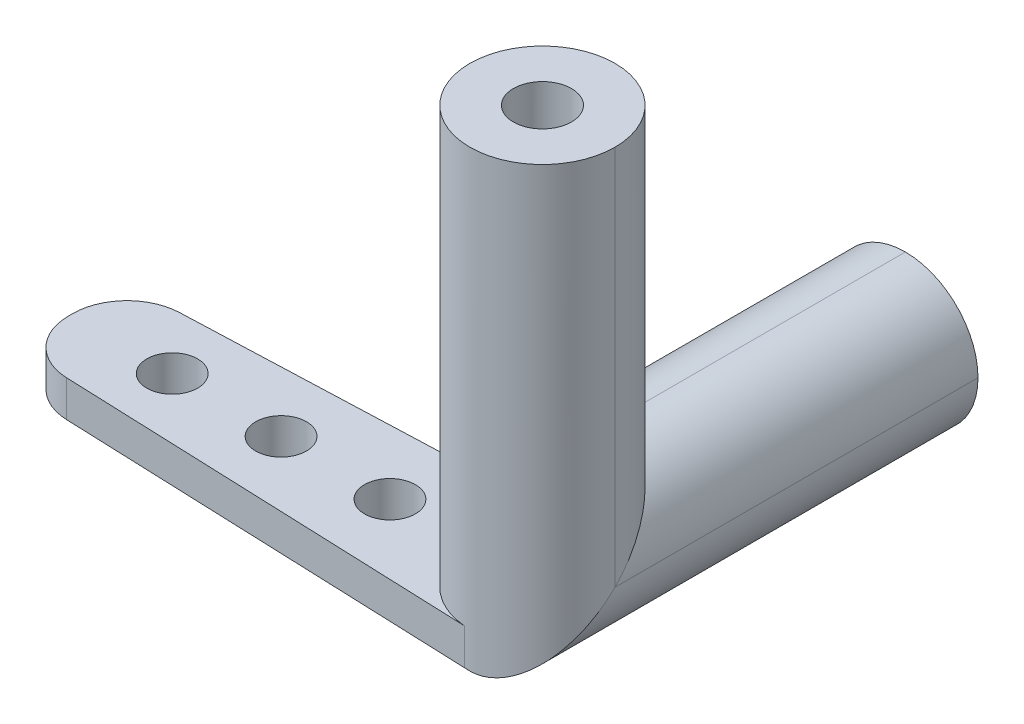
ISO-10303-21;
HEADER;
FILE_DESCRIPTION(('STEP AP214'),'2;1');
FILE_NAME('part.step','',(''),(''),'','','');
FILE_SCHEMA(('AUTOMOTIVE_DESIGN { 1 0 10303 214 1 1 1 1 }'));
ENDSEC;
DATA;
#1=APPLICATION_CONTEXT('core data for automotive mechanical design processes');
#2=APPLICATION_PROTOCOL_DEFINITION('international standard','automotive_design',2000,#1);
#3=PRODUCT_CONTEXT('',#1,'mechanical');
#4=PRODUCT('Part','Part','',(#3));
#5=PRODUCT_RELATED_PRODUCT_CATEGORY('part','',(#4));
#6=PRODUCT_DEFINITION_FORMATION('','',#4);
#7=PRODUCT_DEFINITION_CONTEXT('part definition',#1,'design');
#8=PRODUCT_DEFINITION('design','',#6,#7);
#9=PRODUCT_DEFINITION_SHAPE('','',#8);
#10=(LENGTH_UNIT() NAMED_UNIT(*) SI_UNIT(.MILLI.,.METRE.));
#11=(NAMED_UNIT(*) PLANE_ANGLE_UNIT() SI_UNIT($,.RADIAN.));
#12=(NAMED_UNIT(*) SI_UNIT($,.STERADIAN.) SOLID_ANGLE_UNIT());
#13=UNCERTAINTY_MEASURE_WITH_UNIT(LENGTH_MEASURE(1.E-05),#10,'distance_accuracy_value','');
#14=(GEOMETRIC_REPRESENTATION_CONTEXT(3) GLOBAL_UNCERTAINTY_ASSIGNED_CONTEXT((#13)) GLOBAL_UNIT_ASSIGNED_CONTEXT((#10,
#11,#12)) REPRESENTATION_CONTEXT('',''));
#15=CARTESIAN_POINT('',(0.,0.,0.));
#16=DIRECTION('',(0.,0.,1.));
#17=DIRECTION('',(1.,0.,0.));
#18=AXIS2_PLACEMENT_3D('',#15,#16,#17);
#19=CARTESIAN_POINT('',(2.,2.00000000000001,0.));
#20=DIRECTION('',(0.,0.,-1.));
#21=DIRECTION('',(0.,1.,0.));
#22=AXIS2_PLACEMENT_3D('',#19,#20,#21);
#23=CYLINDRICAL_SURFACE('',#22,2.);
#24=DIRECTION('',(0.,0.,1.));
#25=VECTOR('',#24,1.);
#26=CARTESIAN_POINT('',(2.,0.,-12.));
#27=LINE('',#26,#25);
#28=CARTESIAN_POINT('',(2.,0.,-4.));
#29=VERTEX_POINT('',#28);
#30=CARTESIAN_POINT('',(2.,0.,-12.));
#31=VERTEX_POINT('',#30);
#32=EDGE_CURVE('E385',#29,#31,#27,.F.);
#33=ORIENTED_EDGE('',*,*,#32,.F.);
#34=CARTESIAN_POINT('',(2.,2.,-4.));
#35=DIRECTION('',(0.0384331221012044,0.,0.999261174631314));
#36=DIRECTION('',(0.999261174631314,0.,-0.0384331221012044));
#37=AXIS2_PLACEMENT_3D('',#34,#35,#36);
#38=ELLIPSE('',#37,2.00147874327041,2.);
#39=CARTESIAN_POINT('',(0.26794919243113,0.999999999999994,-3.93338266124735));
#40=VERTEX_POINT('',#39);
#41=EDGE_CURVE('E161',#29,#40,#38,.F.);
#42=ORIENTED_EDGE('',*,*,#41,.T.);
#43=DIRECTION('',(0.,0.,-1.));
#44=VECTOR('',#43,1.);
#45=CARTESIAN_POINT('',(0.26794919243113,1.,0.));
#46=LINE('',#45,#44);
#47=CARTESIAN_POINT('',(0.267949192431128,1.,-0.99999999999999));
#48=VERTEX_POINT('',#47);
#49=EDGE_CURVE('E159',#48,#40,#46,.T.);
#50=ORIENTED_EDGE('',*,*,#49,.F.);
#51=CARTESIAN_POINT('',(2.,2.00000000000001,-2.));
#52=DIRECTION('',(0.,-0.707106781186549,-0.707106781186546));
#53=DIRECTION('',(0.,-0.707106781186546,0.707106781186549));
#54=AXIS2_PLACEMENT_3D('',#51,#52,#53);
#55=ELLIPSE('',#54,2.82842712474619,2.);
#56=CARTESIAN_POINT('',(0.,2.00000000000001,-2.));
#57=VERTEX_POINT('',#56);
#58=EDGE_CURVE('E145',#57,#48,#55,.F.);
#59=ORIENTED_EDGE('',*,*,#58,.F.);
#60=DIRECTION('',(0.,0.,-1.));
#61=VECTOR('',#60,1.);
#62=CARTESIAN_POINT('',(0.,1.99999999999997,-12.));
#63=LINE('',#62,#61);
#64=CARTESIAN_POINT('',(0.,1.99999999999997,-12.));
#65=VERTEX_POINT('',#64);
#66=EDGE_CURVE('E363',#57,#65,#63,.T.);
#67=ORIENTED_EDGE('',*,*,#66,.T.);
#68=CARTESIAN_POINT('',(2.,1.99999999999997,-12.));
#69=DIRECTION('',(0.,0.,-1.));
#70=DIRECTION('',(0.,1.,0.));
#71=AXIS2_PLACEMENT_3D('',#68,#69,#70);
#72=CIRCLE('',#71,2.);
#73=EDGE_CURVE('E372',#31,#65,#72,.T.);
#74=ORIENTED_EDGE('',*,*,#73,.F.);
#75=EDGE_LOOP('',(#33,#42,#50,#59,#67,#74));
#76=FACE_BOUND('',#75,.T.);
#77=ADVANCED_FACE('F43',(#76),#23,.T.);
#78=CARTESIAN_POINT('',(4.,0.,-12.));
#79=DIRECTION('',(0.,0.,-1.));
#80=DIRECTION('',(0.,1.,0.));
#81=AXIS2_PLACEMENT_3D('',#78,#79,#80);
#82=PLANE('',#81);
#83=CARTESIAN_POINT('',(2.,1.99999999999997,-12.));
#84=DIRECTION('',(0.,0.,-1.));
#85=DIRECTION('',(0.,1.,0.));
#86=AXIS2_PLACEMENT_3D('',#83,#84,#85);
#87=CIRCLE('',#86,0.8);
#88=CARTESIAN_POINT('',(2.,2.79999999999997,-12.));
#89=VERTEX_POINT('',#88);
#90=EDGE_CURVE('E188',#89,#89,#87,.T.);
#91=ORIENTED_EDGE('',*,*,#90,.F.);
#92=EDGE_LOOP('',(#91));
#93=FACE_BOUND('',#92,.T.);
#94=CARTESIAN_POINT('',(2.,1.99999999999997,-12.));
#95=DIRECTION('',(0.,0.,-1.));
#96=DIRECTION('',(0.,1.,0.));
#97=AXIS2_PLACEMENT_3D('',#94,#95,#96);
#98=CIRCLE('',#97,2.);
#99=CARTESIAN_POINT('',(2.,3.99999999999997,-12.));
#100=VERTEX_POINT('',#99);
#101=CARTESIAN_POINT('',(4.,1.99999999999997,-12.));
#102=VERTEX_POINT('',#101);
#103=EDGE_CURVE('E366',#100,#102,#98,.T.);
#104=ORIENTED_EDGE('',*,*,#103,.T.);
#105=CARTESIAN_POINT('',(2.,1.99999999999997,-12.));
#106=DIRECTION('',(0.,0.,-1.));
#107=DIRECTION('',(0.,1.,0.));
#108=AXIS2_PLACEMENT_3D('',#105,#106,#107);
#109=CIRCLE('',#108,2.);
#110=EDGE_CURVE('E252',#102,#31,#109,.T.);
#111=ORIENTED_EDGE('',*,*,#110,.T.);
#112=ORIENTED_EDGE('',*,*,#73,.T.);
#113=CARTESIAN_POINT('',(2.,1.99999999999997,-12.));
#114=DIRECTION('',(0.,0.,-1.));
#115=DIRECTION('',(0.,1.,0.));
#116=AXIS2_PLACEMENT_3D('',#113,#114,#115);
#117=CIRCLE('',#116,2.);
#118=EDGE_CURVE('E212',#65,#100,#117,.T.);
#119=ORIENTED_EDGE('',*,*,#118,.T.);
#120=EDGE_LOOP('',(#104,#111,#112,#119));
#121=FACE_BOUND('',#120,.T.);
#122=ADVANCED_FACE('F230',(#93,#121),#82,.T.);
#123=CARTESIAN_POINT('',(4.,12.5,0.));
#124=DIRECTION('',(0.,1.,0.));
#125=DIRECTION('',(0.,0.,1.));
#126=AXIS2_PLACEMENT_3D('',#123,#124,#125);
#127=PLANE('',#126);
#128=CARTESIAN_POINT('',(2.,12.5,-2.));
#129=DIRECTION('',(0.,1.,0.));
#130=DIRECTION('',(0.,0.,1.));
#131=AXIS2_PLACEMENT_3D('',#128,#129,#130);
#132=CIRCLE('',#131,0.8);
#133=CARTESIAN_POINT('',(2.,12.5,-1.2));
#134=VERTEX_POINT('',#133);
#135=EDGE_CURVE('E187',#134,#134,#132,.T.);
#136=ORIENTED_EDGE('',*,*,#135,.F.);
#137=EDGE_LOOP('',(#136));
#138=FACE_BOUND('',#137,.T.);
#139=CARTESIAN_POINT('',(2.,12.5,-2.));
#140=DIRECTION('',(0.,1.,0.));
#141=DIRECTION('',(0.,0.,1.));
#142=AXIS2_PLACEMENT_3D('',#139,#140,#141);
#143=CIRCLE('',#142,2.);
#144=CARTESIAN_POINT('',(0.,12.5,-2.));
#145=VERTEX_POINT('',#144);
#146=CARTESIAN_POINT('',(2.,12.5,0.));
#147=VERTEX_POINT('',#146);
#148=EDGE_CURVE('E194',#145,#147,#143,.T.);
#149=ORIENTED_EDGE('',*,*,#148,.T.);
#150=CARTESIAN_POINT('',(2.,12.5,-2.));
#151=DIRECTION('',(0.,1.,0.));
#152=DIRECTION('',(0.,0.,1.));
#153=AXIS2_PLACEMENT_3D('',#150,#151,#152);
#154=CIRCLE('',#153,2.);
#155=CARTESIAN_POINT('',(4.,12.5,-2.));
#156=VERTEX_POINT('',#155);
#157=EDGE_CURVE('E200',#147,#156,#154,.T.);
#158=ORIENTED_EDGE('',*,*,#157,.T.);
#159=CARTESIAN_POINT('',(2.,12.5,-2.));
#160=DIRECTION('',(0.,1.,0.));
#161=DIRECTION('',(0.,0.,1.));
#162=AXIS2_PLACEMENT_3D('',#159,#160,#161);
#163=CIRCLE('',#162,2.);
#164=CARTESIAN_POINT('',(2.,12.5,-4.));
#165=VERTEX_POINT('',#164);
#166=EDGE_CURVE('E198',#156,#165,#163,.T.);
#167=ORIENTED_EDGE('',*,*,#166,.T.);
#168=CARTESIAN_POINT('',(2.,12.5,-2.));
#169=DIRECTION('',(0.,1.,0.));
#170=DIRECTION('',(0.,0.,1.));
#171=AXIS2_PLACEMENT_3D('',#168,#169,#170);
#172=CIRCLE('',#171,2.);
#173=EDGE_CURVE('E196',#165,#145,#172,.T.);
#174=ORIENTED_EDGE('',*,*,#173,.T.);
#175=EDGE_LOOP('',(#149,#158,#167,#174));
#176=FACE_BOUND('',#175,.T.);
#177=ADVANCED_FACE('F226',(#138,#176),#127,.T.);
#178=CARTESIAN_POINT('',(2.,1.73725830020306,-2.));
#179=DIRECTION('',(0.,1.,0.));
#180=DIRECTION('',(0.,0.,1.));
#181=AXIS2_PLACEMENT_3D('',#178,#179,#180);
#182=CYLINDRICAL_SURFACE('',#181,0.8);
#183=ORIENTED_EDGE('',*,*,#135,.T.);
#184=EDGE_LOOP('',(#183));
#185=FACE_BOUND('',#184,.T.);
#186=CARTESIAN_POINT('',(2.,0.,-2.8));
#187=CARTESIAN_POINT('',(2.02159831677043,-1.8616177813928E-06,-2.8000007467171));
#188=CARTESIAN_POINT('',(2.04318552441436,0.000350269845648965,-2.79912475724533));
#189=CARTESIAN_POINT('',(2.0861904940867,0.00174254682550426,-2.79563599151247));
#190=CARTESIAN_POINT('',(2.10760830440727,0.00278248853754494,-2.7930237297234));
#191=CARTESIAN_POINT('',(2.1712230162056,0.00689257694576575,-2.78263666924842));
#192=CARTESIAN_POINT('',(2.21296956929793,0.0109533376282357,-2.77231125536127));
#193=CARTESIAN_POINT('',(2.29396966864772,0.0213001227870144,-2.74525673480718));
#194=CARTESIAN_POINT('',(2.33322487967818,0.0275846424316137,-2.72853195800847));
#195=CARTESIAN_POINT('',(2.40838776059142,0.0417651950573027,-2.68921650115708));
#196=CARTESIAN_POINT('',(2.44429300078165,0.0496623846525593,-2.66662160784633));
#197=CARTESIAN_POINT('',(2.51340313840996,0.0666769196882175,-2.61510432146704));
#198=CARTESIAN_POINT('',(2.54642877879827,0.075831822927183,-2.58595409872517));
#199=CARTESIAN_POINT('',(2.60727287497054,0.0941587126501767,-2.52263621997696));
#200=CARTESIAN_POINT('',(2.6350893618162,0.103330704275621,-2.48846667545693));
#201=CARTESIAN_POINT('',(2.68595014063606,0.121108920482231,-2.41422839801925));
#202=CARTESIAN_POINT('',(2.70872645876909,0.129671704971954,-2.37396460765669));
#203=CARTESIAN_POINT('',(2.74710218223958,0.144665539592396,-2.2897845697114));
#204=CARTESIAN_POINT('',(2.76270513755407,0.1510976437197,-2.2458701415017));
#205=CARTESIAN_POINT('',(2.78555941721611,0.160694520611915,-2.15771551436484));
#206=CARTESIAN_POINT('',(2.79315743012602,0.163994250627382,-2.11358042410118));
#207=CARTESIAN_POINT('',(2.80086918031491,0.167343981989817,-2.02454693461503));
#208=CARTESIAN_POINT('',(2.80098644314194,0.167395514156073,-1.97964890493238));
#209=CARTESIAN_POINT('',(2.79399571921285,0.164357986492038,-1.89369697804716));
#210=CARTESIAN_POINT('',(2.78739001505455,0.161487250614816,-1.85259301354298));
#211=CARTESIAN_POINT('',(2.76797853172649,0.153295159109221,-1.77213550619189));
#212=CARTESIAN_POINT('',(2.75517177604126,0.147973417513243,-1.7327822401037));
#213=CARTESIAN_POINT('',(2.72347797855633,0.135362090359313,-1.65599305326941));
#214=CARTESIAN_POINT('',(2.70447215978279,0.128034553809571,-1.61861266723954));
#215=CARTESIAN_POINT('',(2.66100278767393,0.112247615385342,-1.54743399539527));
#216=CARTESIAN_POINT('',(2.63653713229394,0.103787778076929,-1.51363709664094));
#217=CARTESIAN_POINT('',(2.58062203969077,0.0858935895915894,-1.44783808829517));
#218=CARTESIAN_POINT('',(2.54877915271876,0.0764344369430068,-1.41617620820553));
#219=CARTESIAN_POINT('',(2.48012954504219,0.0581617170839123,-1.35852917757767));
#220=CARTESIAN_POINT('',(2.44332126754626,0.0493483536894931,-1.33254581413741));
#221=CARTESIAN_POINT('',(2.36481236770107,0.0331370475106564,-1.28654113459255));
#222=CARTESIAN_POINT('',(2.32302785025109,0.0257713387373304,-1.2666510373912));
#223=CARTESIAN_POINT('',(2.23635571338169,0.0135355319165765,-1.23431925966314));
#224=CARTESIAN_POINT('',(2.19147298414069,0.00866159868195644,-1.22186612762088));
#225=CARTESIAN_POINT('',(2.1217837898764,0.0035651618756597,-1.20894554436054));
#226=CARTESIAN_POINT('',(2.09755880874177,0.00223291958890195,-1.20559469629288));
#227=CARTESIAN_POINT('',(2.04889406824094,0.000449035603604759,-1.20112204101431));
#228=CARTESIAN_POINT('',(2.02445452114523,-3.3953392237457E-06,-1.19999823599307));
#229=CARTESIAN_POINT('',(2.,0.,-1.2));
#230=B_SPLINE_CURVE_WITH_KNOTS('',3,(#186,#187,#188,#189,#190,#191,#192,#193,#194,#195,#196,
#197,#198,#199,#200,#201,#202,#203,#204,#205,#206,#207,#208,#209,#210,#211,#212,#213,#214,#215,
#216,#217,#218,#219,#220,#221,#222,#223,#224,#225,#226,#227,#228,#229),.UNSPECIFIED.,.F.,.F.,(4,
2,2,2,2,2,2,2,2,2,2,2,2,2,2,2,2,2,2,2,2,4),(0.,0.0647526799260257,0.129486181639265,
0.258395674984036,0.387218100767083,0.516133245130554,0.65051918153479,0.784955810610358,
0.925384652578942,1.06574392366056,1.19973726465172,1.33366745643372,1.45827660352849,
1.58290537993168,1.71007812612753,1.8372999187355,1.97434772588188,2.11143860172117,
2.25130229661043,2.39095006889911,2.46432062809039,2.53762533901017),.UNSPECIFIED.);
#231=CARTESIAN_POINT('',(2.,0.,-2.8));
#232=VERTEX_POINT('',#231);
#233=CARTESIAN_POINT('',(2.,0.,-1.2));
#234=VERTEX_POINT('',#233);
#235=EDGE_CURVE('E203',#232,#234,#230,.T.);
#236=ORIENTED_EDGE('',*,*,#235,.T.);
#237=CARTESIAN_POINT('',(2.,0.,-2.));
#238=DIRECTION('',(0.,1.,0.));
#239=DIRECTION('',(0.,0.,1.));
#240=AXIS2_PLACEMENT_3D('',#237,#238,#239);
#241=CIRCLE('',#240,0.8);
#242=EDGE_CURVE('E282',#232,#234,#241,.T.);
#243=ORIENTED_EDGE('',*,*,#242,.F.);
#244=EDGE_LOOP('',(#236,#243));
#245=FACE_BOUND('',#244,.T.);
#246=ADVANCED_FACE('F223',(#185,#245),#182,.F.);
#247=CARTESIAN_POINT('',(2.,2.,-4.00000000000001));
#248=DIRECTION('',(0.,0.,-1.));
#249=DIRECTION('',(0.,1.,0.));
#250=AXIS2_PLACEMENT_3D('',#247,#248,#249);
#251=CYLINDRICAL_SURFACE('',#250,0.8);
#252=CARTESIAN_POINT('',(2.,2.,-4.00000000000001));
#253=DIRECTION('',(0.,0.,-1.));
#254=DIRECTION('',(0.,1.,0.));
#255=AXIS2_PLACEMENT_3D('',#252,#253,#254);
#256=CIRCLE('',#255,0.8);
#257=CARTESIAN_POINT('',(2.,2.8,-4.00000000000001));
#258=VERTEX_POINT('',#257);
#259=EDGE_CURVE('E184',#258,#258,#256,.T.);
#260=ORIENTED_EDGE('',*,*,#259,.F.);
#261=EDGE_LOOP('',(#260));
#262=FACE_BOUND('',#261,.T.);
#263=ORIENTED_EDGE('',*,*,#90,.T.);
#264=EDGE_LOOP('',(#263));
#265=FACE_BOUND('',#264,.T.);
#266=ADVANCED_FACE('F221',(#262,#265),#251,.F.);
#267=CARTESIAN_POINT('',(2.,2.,-4.00000000000001));
#268=DIRECTION('',(0.,0.,-1.));
#269=DIRECTION('',(0.,1.,0.));
#270=AXIS2_PLACEMENT_3D('',#267,#268,#269);
#271=PLANE('',#270);
#272=ORIENTED_EDGE('',*,*,#259,.T.);
#273=EDGE_LOOP('',(#272));
#274=FACE_BOUND('',#273,.T.);
#275=ADVANCED_FACE('F349',(#274),#271,.T.);
#276=CARTESIAN_POINT('',(2.,2.00000000000002,0.));
#277=DIRECTION('',(0.,0.,1.));
#278=DIRECTION('',(0.,-1.,0.));
#279=AXIS2_PLACEMENT_3D('',#276,#277,#278);
#280=CYLINDRICAL_SURFACE('',#279,2.);
#281=DIRECTION('',(0.,0.,-1.));
#282=VECTOR('',#281,1.);
#283=CARTESIAN_POINT('',(2.,4.,-4.));
#284=LINE('',#283,#282);
#285=CARTESIAN_POINT('',(2.,4.,-4.));
#286=VERTEX_POINT('',#285);
#287=EDGE_CURVE('E191',#100,#286,#284,.F.);
#288=ORIENTED_EDGE('',*,*,#287,.F.);
#289=ORIENTED_EDGE('',*,*,#118,.F.);
#290=ORIENTED_EDGE('',*,*,#66,.F.);
#291=CARTESIAN_POINT('',(2.,2.00000000000001,-2.));
#292=DIRECTION('',(0.,0.707106781186549,0.707106781186546));
#293=DIRECTION('',(0.,0.707106781186546,-0.707106781186549));
#294=AXIS2_PLACEMENT_3D('',#291,#292,#293);
#295=ELLIPSE('',#294,2.82842712474619,2.);
#296=EDGE_CURVE('E361',#286,#57,#295,.T.);
#297=ORIENTED_EDGE('',*,*,#296,.F.);
#298=EDGE_LOOP('',(#288,#289,#290,#297));
#299=FACE_BOUND('',#298,.T.);
#300=ADVANCED_FACE('F346',(#299),#280,.T.);
#301=CARTESIAN_POINT('',(2.,2.00000000000002,0.));
#302=DIRECTION('',(0.,0.,-1.));
#303=DIRECTION('',(0.,1.,0.));
#304=AXIS2_PLACEMENT_3D('',#301,#302,#303);
#305=CYLINDRICAL_SURFACE('',#304,2.);
#306=ORIENTED_EDGE('',*,*,#103,.F.);
#307=ORIENTED_EDGE('',*,*,#287,.T.);
#308=CARTESIAN_POINT('',(2.,2.00000000000001,-2.));
#309=DIRECTION('',(0.,-0.707106781186549,-0.707106781186546));
#310=DIRECTION('',(0.,-0.707106781186546,0.707106781186549));
#311=AXIS2_PLACEMENT_3D('',#308,#309,#310);
#312=ELLIPSE('',#311,2.82842712474619,2.);
#313=CARTESIAN_POINT('',(4.,2.00000000000001,-2.));
#314=VERTEX_POINT('',#313);
#315=EDGE_CURVE('E387',#314,#286,#312,.F.);
#316=ORIENTED_EDGE('',*,*,#315,.F.);
#317=DIRECTION('',(0.,0.,-1.));
#318=VECTOR('',#317,1.);
#319=CARTESIAN_POINT('',(4.,2.00000000000002,0.));
#320=LINE('',#319,#318);
#321=EDGE_CURVE('E368',#102,#314,#320,.F.);
#322=ORIENTED_EDGE('',*,*,#321,.F.);
#323=EDGE_LOOP('',(#306,#307,#316,#322));
#324=FACE_BOUND('',#323,.T.);
#325=ADVANCED_FACE('F343',(#324),#305,.T.);
#326=CARTESIAN_POINT('',(2.,0.,-2.));
#327=DIRECTION('',(0.,1.,0.));
#328=DIRECTION('',(0.,0.,1.));
#329=AXIS2_PLACEMENT_3D('',#326,#327,#328);
#330=CYLINDRICAL_SURFACE('',#329,2.);
#331=DIRECTION('',(0.,1.,0.));
#332=VECTOR('',#331,1.);
#333=CARTESIAN_POINT('',(0.,0.,-2.));
#334=LINE('',#333,#332);
#335=EDGE_CURVE('E153',#145,#57,#334,.F.);
#336=ORIENTED_EDGE('',*,*,#335,.F.);
#337=ORIENTED_EDGE('',*,*,#173,.F.);
#338=DIRECTION('',(0.,1.,0.));
#339=VECTOR('',#338,1.);
#340=CARTESIAN_POINT('',(2.,0.,-4.));
#341=LINE('',#340,#339);
#342=EDGE_CURVE('E390',#286,#165,#341,.T.);
#343=ORIENTED_EDGE('',*,*,#342,.F.);
#344=ORIENTED_EDGE('',*,*,#296,.T.);
#345=EDGE_LOOP('',(#336,#337,#343,#344));
#346=FACE_BOUND('',#345,.T.);
#347=ADVANCED_FACE('F342',(#346),#330,.T.);
#348=CARTESIAN_POINT('',(2.,0.,-2.));
#349=DIRECTION('',(0.,-1.,0.));
#350=DIRECTION('',(0.,0.,-1.));
#351=AXIS2_PLACEMENT_3D('',#348,#349,#350);
#352=CYLINDRICAL_SURFACE('',#351,2.);
#353=ORIENTED_EDGE('',*,*,#342,.T.);
#354=ORIENTED_EDGE('',*,*,#166,.F.);
#355=DIRECTION('',(0.,1.,0.));
#356=VECTOR('',#355,1.);
#357=CARTESIAN_POINT('',(4.,12.5,-2.));
#358=LINE('',#357,#356);
#359=EDGE_CURVE('E379',#314,#156,#358,.T.);
#360=ORIENTED_EDGE('',*,*,#359,.F.);
#361=ORIENTED_EDGE('',*,*,#315,.T.);
#362=EDGE_LOOP('',(#353,#354,#360,#361));
#363=FACE_BOUND('',#362,.T.);
#364=ADVANCED_FACE('F522',(#363),#352,.T.);
#365=CARTESIAN_POINT('',(2.,2.00000000000001,0.));
#366=DIRECTION('',(0.,0.,1.));
#367=DIRECTION('',(0.,-1.,0.));
#368=AXIS2_PLACEMENT_3D('',#365,#366,#367);
#369=CYLINDRICAL_SURFACE('',#368,2.);
#370=ORIENTED_EDGE('',*,*,#110,.F.);
#371=ORIENTED_EDGE('',*,*,#321,.T.);
#372=CARTESIAN_POINT('',(2.,2.00000000000001,-2.));
#373=DIRECTION('',(0.,0.707106781186549,0.707106781186546));
#374=DIRECTION('',(0.,-0.707106781186546,0.707106781186549));
#375=AXIS2_PLACEMENT_3D('',#372,#373,#374);
#376=ELLIPSE('',#375,2.82842712474619,2.);
#377=CARTESIAN_POINT('',(2.,0.,0.));
#378=VERTEX_POINT('',#377);
#379=EDGE_CURVE('E378',#378,#314,#376,.T.);
#380=ORIENTED_EDGE('',*,*,#379,.F.);
#381=DIRECTION('',(0.,0.,1.));
#382=VECTOR('',#381,1.);
#383=CARTESIAN_POINT('',(2.,0.,-12.));
#384=LINE('',#383,#382);
#385=EDGE_CURVE('E156',#378,#234,#384,.F.);
#386=ORIENTED_EDGE('',*,*,#385,.T.);
#387=ORIENTED_EDGE('',*,*,#235,.F.);
#388=EDGE_CURVE('E382',#232,#29,#27,.F.);
#389=ORIENTED_EDGE('',*,*,#388,.T.);
#390=ORIENTED_EDGE('',*,*,#32,.T.);
#391=EDGE_LOOP('',(#370,#371,#380,#386,#387,#389,#390));
#392=FACE_BOUND('',#391,.T.);
#393=ADVANCED_FACE('F214',(#392),#369,.T.);
#394=CARTESIAN_POINT('',(2.,0.,-2.));
#395=DIRECTION('',(0.,-1.,0.));
#396=DIRECTION('',(0.,0.,-1.));
#397=AXIS2_PLACEMENT_3D('',#394,#395,#396);
#398=CYLINDRICAL_SURFACE('',#397,2.);
#399=DIRECTION('',(0.,-1.,0.));
#400=VECTOR('',#399,1.);
#401=CARTESIAN_POINT('',(1.8463810930576,0.,-0.00590841949778489));
#402=LINE('',#401,#400);
#403=CARTESIAN_POINT('',(1.8463810930576,0.00590841949779783,-0.00590841949778481));
#404=VERTEX_POINT('',#403);
#405=CARTESIAN_POINT('',(1.8463810930576,1.,-0.00590841949778445));
#406=VERTEX_POINT('',#405);
#407=EDGE_CURVE('E162',#404,#406,#402,.F.);
#408=ORIENTED_EDGE('',*,*,#407,.F.);
#409=CARTESIAN_POINT('',(2.,0.,0.));
#410=CARTESIAN_POINT('',(1.92307692307693,0.,-0.00295857988165671));
#411=CARTESIAN_POINT('',(1.8463810930576,0.00590841949779826,-0.00590841949778444));
#412=B_SPLINE_CURVE_WITH_KNOTS('',2,(#409,#410,#411),.UNSPECIFIED.,.F.,.F.,(3,3),(0.,1.),.UNSPECIFIED.);
#413=EDGE_CURVE('E181',#378,#404,#412,.T.);
#414=ORIENTED_EDGE('',*,*,#413,.F.);
#415=ORIENTED_EDGE('',*,*,#379,.T.);
#416=ORIENTED_EDGE('',*,*,#359,.T.);
#417=ORIENTED_EDGE('',*,*,#157,.F.);
#418=DIRECTION('',(0.,1.,0.));
#419=VECTOR('',#418,1.);
#420=CARTESIAN_POINT('',(2.,0.,0.));
#421=LINE('',#420,#419);
#422=CARTESIAN_POINT('',(2.,1.,0.));
#423=VERTEX_POINT('',#422);
#424=EDGE_CURVE('E376',#147,#423,#421,.F.);
#425=ORIENTED_EDGE('',*,*,#424,.T.);
#426=ORIENTED_EDGE('',*,*,#424,.F.);
#427=ORIENTED_EDGE('',*,*,#148,.F.);
#428=ORIENTED_EDGE('',*,*,#335,.T.);
#429=ORIENTED_EDGE('',*,*,#58,.T.);
#430=CARTESIAN_POINT('',(2.,1.,-2.));
#431=DIRECTION('',(0.,1.,0.));
#432=DIRECTION('',(0.,0.,1.));
#433=AXIS2_PLACEMENT_3D('',#430,#431,#432);
#434=CIRCLE('',#433,2.);
#435=EDGE_CURVE('E149',#406,#48,#434,.F.);
#436=ORIENTED_EDGE('',*,*,#435,.F.);
#437=EDGE_LOOP('',(#408,#414,#415,#416,#417,#425,#426,#427,#428,#429,#436));
#438=FACE_BOUND('',#437,.T.);
#439=ADVANCED_FACE('F147',(#438),#398,.T.);
#440=CARTESIAN_POINT('',(-0.150664697193501,1.,-3.91728212703102));
#441=DIRECTION('',(0.0384331221012044,0.,0.999261174631314));
#442=DIRECTION('',(0.999261174631314,0.,-0.0384331221012044));
#443=AXIS2_PLACEMENT_3D('',#440,#441,#442);
#444=PLANE('',#443);
#445=DIRECTION('',(-0.999261174631314,0.,0.0384331221012044));
#446=VECTOR('',#445,1.);
#447=CARTESIAN_POINT('',(-0.150664697193501,0.,-3.91728212703102));
#448=LINE('',#447,#446);
#449=CARTESIAN_POINT('',(-9.5576496831518,0.,-3.55547501218647));
#450=VERTEX_POINT('',#449);
#451=EDGE_CURVE('E280',#29,#450,#448,.T.);
#452=ORIENTED_EDGE('',*,*,#451,.T.);
#453=DIRECTION('',(0.,-1.,0.));
#454=VECTOR('',#453,1.);
#455=CARTESIAN_POINT('',(-9.5576496831518,1.,-3.55547501218647));
#456=LINE('',#455,#454);
#457=CARTESIAN_POINT('',(-9.5576496831518,1.,-3.55547501218647));
#458=VERTEX_POINT('',#457);
#459=EDGE_CURVE('E11',#450,#458,#456,.F.);
#460=ORIENTED_EDGE('',*,*,#459,.T.);
#461=DIRECTION('',(-0.999261174631314,0.,0.0384331221012044));
#462=VECTOR('',#461,1.);
#463=CARTESIAN_POINT('',(-0.150664697193501,1.,-3.91728212703102));
#464=LINE('',#463,#462);
#465=EDGE_CURVE('E281',#40,#458,#464,.T.);
#466=ORIENTED_EDGE('',*,*,#465,.F.);
#467=ORIENTED_EDGE('',*,*,#41,.F.);
#468=EDGE_LOOP('',(#452,#460,#466,#467));
#469=FACE_BOUND('',#468,.T.);
#470=ADVANCED_FACE('F236',(#469),#444,.F.);
#471=CARTESIAN_POINT('',(-11.,1.,0.));
#472=DIRECTION('',(-1.,0.,0.));
#473=DIRECTION('',(0.,0.,1.));
#474=AXIS2_PLACEMENT_3D('',#471,#472,#473);
#475=PLANE('',#474);
#476=DIRECTION('',(0.,0.,-1.));
#477=VECTOR('',#476,1.);
#478=CARTESIAN_POINT('',(-11.,0.,0.));
#479=LINE('',#478,#477);
#480=CARTESIAN_POINT('',(-11.,0.,-1.9434167497605));
#481=VERTEX_POINT('',#480);
#482=CARTESIAN_POINT('',(-11.,0.,-2.0565832502395));
#483=VERTEX_POINT('',#482);
#484=EDGE_CURVE('E172',#481,#483,#479,.T.);
#485=ORIENTED_EDGE('',*,*,#484,.F.);
#486=DIRECTION('',(0.,-1.,0.));
#487=VECTOR('',#486,1.);
#488=CARTESIAN_POINT('',(-11.,1.,-1.9434167497605));
#489=LINE('',#488,#487);
#490=CARTESIAN_POINT('',(-11.,1.,-1.9434167497605));
#491=VERTEX_POINT('',#490);
#492=EDGE_CURVE('E259',#481,#491,#489,.F.);
#493=ORIENTED_EDGE('',*,*,#492,.T.);
#494=DIRECTION('',(0.,0.,-1.));
#495=VECTOR('',#494,1.);
#496=CARTESIAN_POINT('',(-11.,1.,0.));
#497=LINE('',#496,#495);
#498=CARTESIAN_POINT('',(-11.,1.,-2.0565832502395));
#499=VERTEX_POINT('',#498);
#500=EDGE_CURVE('E169',#491,#499,#497,.T.);
#501=ORIENTED_EDGE('',*,*,#500,.T.);
#502=DIRECTION('',(0.,-1.,0.));
#503=VECTOR('',#502,1.);
#504=CARTESIAN_POINT('',(-11.,0.,-2.0565832502395));
#505=LINE('',#504,#503);
#506=EDGE_CURVE('E256',#499,#483,#505,.T.);
#507=ORIENTED_EDGE('',*,*,#506,.T.);
#508=EDGE_LOOP('',(#485,#493,#501,#507));
#509=FACE_BOUND('',#508,.T.);
#510=ADVANCED_FACE('F278',(#509),#475,.T.);
#511=CARTESIAN_POINT('',(0.00295420974889217,1.,-0.0768094534711965));
#512=DIRECTION('',(-0.0384331221012044,0.,0.999261174631314));
#513=DIRECTION('',(0.999261174631314,0.,0.0384331221012044));
#514=AXIS2_PLACEMENT_3D('',#511,#512,#513);
#515=PLANE('',#514);
#516=DIRECTION('',(-0.999261174631314,0.,-0.0384331221012044));
#517=VECTOR('',#516,1.);
#518=CARTESIAN_POINT('',(0.00295420974889217,1.,-0.0768094534711965));
#519=LINE('',#518,#517);
#520=CARTESIAN_POINT('',(-9.5576496831518,1.,-0.444524987813531));
#521=VERTEX_POINT('',#520);
#522=EDGE_CURVE('E167',#406,#521,#519,.T.);
#523=ORIENTED_EDGE('',*,*,#522,.T.);
#524=DIRECTION('',(0.,-1.,0.));
#525=VECTOR('',#524,1.);
#526=CARTESIAN_POINT('',(-9.55764968315181,1.,-0.444524987813531));
#527=LINE('',#526,#525);
#528=CARTESIAN_POINT('',(-9.5576496831518,0.,-0.444524987813531));
#529=VERTEX_POINT('',#528);
#530=EDGE_CURVE('E243',#521,#529,#527,.T.);
#531=ORIENTED_EDGE('',*,*,#530,.T.);
#532=DIRECTION('',(-0.999261174631314,0.,-0.0384331221012044));
#533=VECTOR('',#532,1.);
#534=CARTESIAN_POINT('',(0.00295420974889217,0.,-0.0768094534711965));
#535=LINE('',#534,#533);
#536=EDGE_CURVE('E276',#378,#529,#535,.T.);
#537=ORIENTED_EDGE('',*,*,#536,.F.);
#538=ORIENTED_EDGE('',*,*,#413,.T.);
#539=ORIENTED_EDGE('',*,*,#407,.T.);
#540=EDGE_LOOP('',(#523,#531,#537,#538,#539));
#541=FACE_BOUND('',#540,.T.);
#542=ADVANCED_FACE('F266',(#541),#515,.T.);
#543=CARTESIAN_POINT('',(0.,1.,0.));
#544=DIRECTION('',(0.,1.,0.));
#545=DIRECTION('',(0.,0.,1.));
#546=AXIS2_PLACEMENT_3D('',#543,#544,#545);
#547=PLANE('',#546);
#548=CARTESIAN_POINT('',(-2.2,1.,-2.));
#549=DIRECTION('',(0.,1.,0.));
#550=DIRECTION('',(0.,0.,1.));
#551=AXIS2_PLACEMENT_3D('',#548,#549,#550);
#552=CIRCLE('',#551,0.7);
#553=CARTESIAN_POINT('',(-2.2,1.,-1.3));
#554=VERTEX_POINT('',#553);
#555=EDGE_CURVE('E300',#554,#554,#552,.T.);
#556=ORIENTED_EDGE('',*,*,#555,.F.);
#557=EDGE_LOOP('',(#556));
#558=FACE_BOUND('',#557,.T.);
#559=CARTESIAN_POINT('',(-5.2,1.,-2.));
#560=DIRECTION('',(0.,1.,0.));
#561=DIRECTION('',(0.,0.,1.));
#562=AXIS2_PLACEMENT_3D('',#559,#560,#561);
#563=CIRCLE('',#562,0.7);
#564=CARTESIAN_POINT('',(-5.2,1.,-1.3));
#565=VERTEX_POINT('',#564);
#566=EDGE_CURVE('E297',#565,#565,#563,.T.);
#567=ORIENTED_EDGE('',*,*,#566,.F.);
#568=EDGE_LOOP('',(#567));
#569=FACE_BOUND('',#568,.T.);
#570=CARTESIAN_POINT('',(-8.2,1.,-2.));
#571=DIRECTION('',(0.,1.,0.));
#572=DIRECTION('',(0.,0.,1.));
#573=AXIS2_PLACEMENT_3D('',#570,#571,#572);
#574=CIRCLE('',#573,0.7);
#575=CARTESIAN_POINT('',(-8.2,1.,-1.3));
#576=VERTEX_POINT('',#575);
#577=EDGE_CURVE('E290',#576,#576,#574,.T.);
#578=ORIENTED_EDGE('',*,*,#577,.F.);
#579=EDGE_LOOP('',(#578));
#580=FACE_BOUND('',#579,.T.);
#581=ORIENTED_EDGE('',*,*,#500,.F.);
#582=CARTESIAN_POINT('',(-9.5,1.,-1.9434167497605));
#583=DIRECTION('',(0.,1.,0.));
#584=DIRECTION('',(0.,0.,1.));
#585=AXIS2_PLACEMENT_3D('',#582,#583,#584);
#586=CIRCLE('',#585,1.5);
#587=EDGE_CURVE('E51',#491,#521,#586,.T.);
#588=ORIENTED_EDGE('',*,*,#587,.T.);
#589=ORIENTED_EDGE('',*,*,#522,.F.);
#590=ORIENTED_EDGE('',*,*,#435,.T.);
#591=ORIENTED_EDGE('',*,*,#49,.T.);
#592=ORIENTED_EDGE('',*,*,#465,.T.);
#593=CARTESIAN_POINT('',(-9.5,1.,-2.0565832502395));
#594=DIRECTION('',(0.,1.,0.));
#595=DIRECTION('',(0.,0.,1.));
#596=AXIS2_PLACEMENT_3D('',#593,#594,#595);
#597=CIRCLE('',#596,1.5);
#598=EDGE_CURVE('E63',#458,#499,#597,.T.);
#599=ORIENTED_EDGE('',*,*,#598,.T.);
#600=EDGE_LOOP('',(#581,#588,#589,#590,#591,#592,#599));
#601=FACE_BOUND('',#600,.T.);
#602=ADVANCED_FACE('F165',(#558,#569,#580,#601),#547,.T.);
#603=CARTESIAN_POINT('',(0.,0.,0.));
#604=DIRECTION('',(0.,1.,0.));
#605=DIRECTION('',(0.,0.,1.));
#606=AXIS2_PLACEMENT_3D('',#603,#604,#605);
#607=PLANE('',#606);
#608=CARTESIAN_POINT('',(-2.2,0.,-2.));
#609=DIRECTION('',(0.,1.,0.));
#610=DIRECTION('',(0.,0.,1.));
#611=AXIS2_PLACEMENT_3D('',#608,#609,#610);
#612=CIRCLE('',#611,0.7);
#613=CARTESIAN_POINT('',(-2.2,0.,-1.3));
#614=VERTEX_POINT('',#613);
#615=EDGE_CURVE('E285',#614,#614,#612,.F.);
#616=ORIENTED_EDGE('',*,*,#615,.F.);
#617=EDGE_LOOP('',(#616));
#618=FACE_BOUND('',#617,.T.);
#619=CARTESIAN_POINT('',(-5.2,0.,-2.));
#620=DIRECTION('',(0.,1.,0.));
#621=DIRECTION('',(0.,0.,1.));
#622=AXIS2_PLACEMENT_3D('',#619,#620,#621);
#623=CIRCLE('',#622,0.7);
#624=CARTESIAN_POINT('',(-5.2,0.,-1.3));
#625=VERTEX_POINT('',#624);
#626=EDGE_CURVE('E293',#625,#625,#623,.F.);
#627=ORIENTED_EDGE('',*,*,#626,.F.);
#628=EDGE_LOOP('',(#627));
#629=FACE_BOUND('',#628,.T.);
#630=CARTESIAN_POINT('',(-8.2,0.,-2.));
#631=DIRECTION('',(0.,1.,0.));
#632=DIRECTION('',(0.,0.,1.));
#633=AXIS2_PLACEMENT_3D('',#630,#631,#632);
#634=CIRCLE('',#633,0.7);
#635=CARTESIAN_POINT('',(-8.2,0.,-1.3));
#636=VERTEX_POINT('',#635);
#637=EDGE_CURVE('E294',#636,#636,#634,.F.);
#638=ORIENTED_EDGE('',*,*,#637,.F.);
#639=EDGE_LOOP('',(#638));
#640=FACE_BOUND('',#639,.T.);
#641=ORIENTED_EDGE('',*,*,#536,.T.);
#642=CARTESIAN_POINT('',(-9.5,0.,-1.9434167497605));
#643=DIRECTION('',(0.,1.,0.));
#644=DIRECTION('',(0.,0.,1.));
#645=AXIS2_PLACEMENT_3D('',#642,#643,#644);
#646=CIRCLE('',#645,1.5);
#647=EDGE_CURVE('E254',#529,#481,#646,.F.);
#648=ORIENTED_EDGE('',*,*,#647,.T.);
#649=ORIENTED_EDGE('',*,*,#484,.T.);
#650=CARTESIAN_POINT('',(-9.5,0.,-2.0565832502395));
#651=DIRECTION('',(0.,1.,0.));
#652=DIRECTION('',(0.,0.,1.));
#653=AXIS2_PLACEMENT_3D('',#650,#651,#652);
#654=CIRCLE('',#653,1.5);
#655=EDGE_CURVE('E251',#483,#450,#654,.F.);
#656=ORIENTED_EDGE('',*,*,#655,.T.);
#657=ORIENTED_EDGE('',*,*,#451,.F.);
#658=ORIENTED_EDGE('',*,*,#388,.F.);
#659=ORIENTED_EDGE('',*,*,#242,.T.);
#660=ORIENTED_EDGE('',*,*,#385,.F.);
#661=EDGE_LOOP('',(#641,#648,#649,#656,#657,#658,#659,#660));
#662=FACE_BOUND('',#661,.T.);
#663=ADVANCED_FACE('F274',(#618,#629,#640,#662),#607,.F.);
#664=CARTESIAN_POINT('',(-9.5,1.,-1.9434167497605));
#665=DIRECTION('',(0.,-1.,0.));
#666=DIRECTION('',(0.,0.,-1.));
#667=AXIS2_PLACEMENT_3D('',#664,#665,#666);
#668=CYLINDRICAL_SURFACE('',#667,1.5);
#669=ORIENTED_EDGE('',*,*,#587,.F.);
#670=ORIENTED_EDGE('',*,*,#492,.F.);
#671=ORIENTED_EDGE('',*,*,#647,.F.);
#672=ORIENTED_EDGE('',*,*,#530,.F.);
#673=EDGE_LOOP('',(#669,#670,#671,#672));
#674=FACE_BOUND('',#673,.T.);
#675=ADVANCED_FACE('F270',(#674),#668,.T.);
#676=CARTESIAN_POINT('',(-9.5,1.,-2.0565832502395));
#677=DIRECTION('',(0.,1.,0.));
#678=DIRECTION('',(0.,0.,1.));
#679=AXIS2_PLACEMENT_3D('',#676,#677,#678);
#680=CYLINDRICAL_SURFACE('',#679,1.5);
#681=ORIENTED_EDGE('',*,*,#598,.F.);
#682=ORIENTED_EDGE('',*,*,#459,.F.);
#683=ORIENTED_EDGE('',*,*,#655,.F.);
#684=ORIENTED_EDGE('',*,*,#506,.F.);
#685=EDGE_LOOP('',(#681,#682,#683,#684));
#686=FACE_BOUND('',#685,.T.);
#687=ADVANCED_FACE('F45',(#686),#680,.T.);
#688=CARTESIAN_POINT('',(-8.2,-0.0120109325238184,-2.));
#689=DIRECTION('',(0.,1.,0.));
#690=DIRECTION('',(0.,0.,1.));
#691=AXIS2_PLACEMENT_3D('',#688,#689,#690);
#692=CYLINDRICAL_SURFACE('',#691,0.7);
#693=ORIENTED_EDGE('',*,*,#577,.T.);
#694=EDGE_LOOP('',(#693));
#695=FACE_BOUND('',#694,.T.);
#696=ORIENTED_EDGE('',*,*,#637,.T.);
#697=EDGE_LOOP('',(#696));
#698=FACE_BOUND('',#697,.T.);
#699=ADVANCED_FACE('F318',(#695,#698),#692,.F.);
#700=CARTESIAN_POINT('',(-5.2,-0.0120109325238184,-2.));
#701=DIRECTION('',(0.,1.,0.));
#702=DIRECTION('',(0.,0.,1.));
#703=AXIS2_PLACEMENT_3D('',#700,#701,#702);
#704=CYLINDRICAL_SURFACE('',#703,0.7);
#705=ORIENTED_EDGE('',*,*,#566,.T.);
#706=EDGE_LOOP('',(#705));
#707=FACE_BOUND('',#706,.T.);
#708=ORIENTED_EDGE('',*,*,#626,.T.);
#709=EDGE_LOOP('',(#708));
#710=FACE_BOUND('',#709,.T.);
#711=ADVANCED_FACE('F321',(#707,#710),#704,.F.);
#712=CARTESIAN_POINT('',(-2.2,-0.0120109325238184,-2.));
#713=DIRECTION('',(0.,1.,0.));
#714=DIRECTION('',(0.,0.,1.));
#715=AXIS2_PLACEMENT_3D('',#712,#713,#714);
#716=CYLINDRICAL_SURFACE('',#715,0.7);
#717=ORIENTED_EDGE('',*,*,#555,.T.);
#718=EDGE_LOOP('',(#717));
#719=FACE_BOUND('',#718,.T.);
#720=ORIENTED_EDGE('',*,*,#615,.T.);
#721=EDGE_LOOP('',(#720));
#722=FACE_BOUND('',#721,.T.);
#723=ADVANCED_FACE('F308',(#719,#722),#716,.F.);
#724=CLOSED_SHELL('',(#77,#122,#177,#246,#266,#275,#300,#325,#347,#364,#393,#439,#470,#510,#542,
#602,#663,#675,#687,#699,#711,#723));
#725=MANIFOLD_SOLID_BREP('B2',#724);
#726=ADVANCED_BREP_SHAPE_REPRESENTATION('',(#18,#725),#14);
#727=SHAPE_DEFINITION_REPRESENTATION(#9,#726);
ENDSEC;
END-ISO-10303-21;
